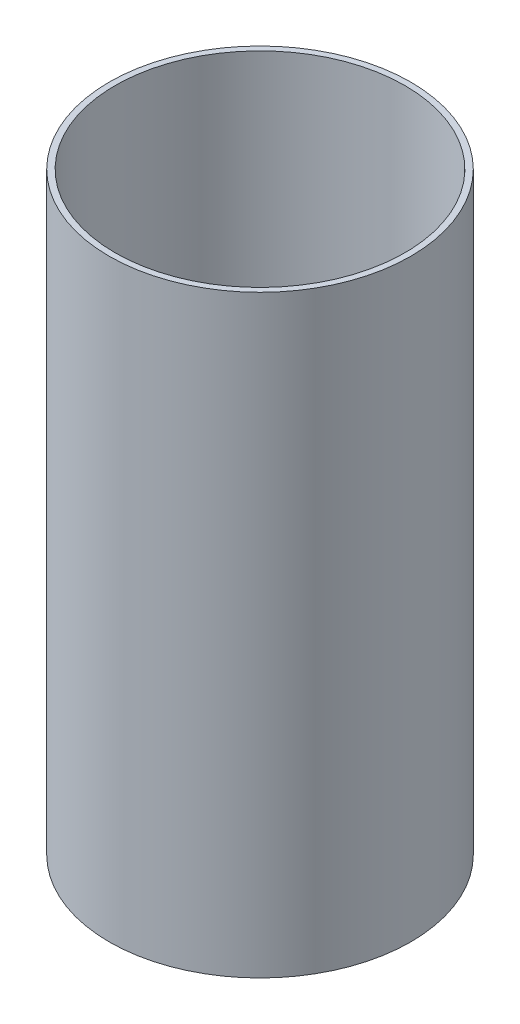
ISO-10303-21;
HEADER;
FILE_DESCRIPTION(('STEP AP214'),'2;1');
FILE_NAME('part.step','',(''),(''),'','','');
FILE_SCHEMA(('AUTOMOTIVE_DESIGN { 1 0 10303 214 1 1 1 1 }'));
ENDSEC;
DATA;
#1=APPLICATION_CONTEXT('core data for automotive mechanical design processes');
#2=APPLICATION_PROTOCOL_DEFINITION('international standard','automotive_design',2000,#1);
#3=PRODUCT_CONTEXT('',#1,'mechanical');
#4=PRODUCT('Part','Part','',(#3));
#5=PRODUCT_RELATED_PRODUCT_CATEGORY('part','',(#4));
#6=PRODUCT_DEFINITION_FORMATION('','',#4);
#7=PRODUCT_DEFINITION_CONTEXT('part definition',#1,'design');
#8=PRODUCT_DEFINITION('design','',#6,#7);
#9=PRODUCT_DEFINITION_SHAPE('','',#8);
#10=(LENGTH_UNIT() NAMED_UNIT(*) SI_UNIT(.MILLI.,.METRE.));
#11=(NAMED_UNIT(*) PLANE_ANGLE_UNIT() SI_UNIT($,.RADIAN.));
#12=(NAMED_UNIT(*) SI_UNIT($,.STERADIAN.) SOLID_ANGLE_UNIT());
#13=UNCERTAINTY_MEASURE_WITH_UNIT(LENGTH_MEASURE(1.E-05),#10,'distance_accuracy_value','');
#14=(GEOMETRIC_REPRESENTATION_CONTEXT(3) GLOBAL_UNCERTAINTY_ASSIGNED_CONTEXT((#13)) GLOBAL_UNIT_ASSIGNED_CONTEXT((#10,
#11,#12)) REPRESENTATION_CONTEXT('',''));
#15=CARTESIAN_POINT('',(0.,0.,0.));
#16=DIRECTION('',(0.,0.,1.));
#17=DIRECTION('',(1.,0.,0.));
#18=AXIS2_PLACEMENT_3D('',#15,#16,#17);
#19=CARTESIAN_POINT('',(0.,-150.,0.));
#20=DIRECTION('',(0.,1.,0.));
#21=DIRECTION('',(0.,0.,1.));
#22=AXIS2_PLACEMENT_3D('',#19,#20,#21);
#23=CYLINDRICAL_SURFACE('',#22,76.2);
#24=CARTESIAN_POINT('',(0.,-150.,0.));
#25=DIRECTION('',(0.,1.,0.));
#26=DIRECTION('',(0.,0.,1.));
#27=AXIS2_PLACEMENT_3D('',#24,#25,#26);
#28=CIRCLE('',#27,76.2);
#29=CARTESIAN_POINT('',(0.,-150.,76.2));
#30=VERTEX_POINT('',#29);
#31=EDGE_CURVE('E10',#30,#30,#28,.T.);
#32=ORIENTED_EDGE('',*,*,#31,.T.);
#33=EDGE_LOOP('',(#32));
#34=FACE_BOUND('',#33,.T.);
#35=CARTESIAN_POINT('',(0.,150.,0.));
#36=DIRECTION('',(0.,1.,0.));
#37=DIRECTION('',(0.,0.,1.));
#38=AXIS2_PLACEMENT_3D('',#35,#36,#37);
#39=CIRCLE('',#38,76.2);
#40=CARTESIAN_POINT('',(0.,150.,76.2));
#41=VERTEX_POINT('',#40);
#42=EDGE_CURVE('E49',#41,#41,#39,.T.);
#43=ORIENTED_EDGE('',*,*,#42,.F.);
#44=EDGE_LOOP('',(#43));
#45=FACE_BOUND('',#44,.T.);
#46=ADVANCED_FACE('F37',(#34,#45),#23,.T.);
#47=CARTESIAN_POINT('',(0.,-150.,0.));
#48=DIRECTION('',(0.,1.,0.));
#49=DIRECTION('',(0.,0.,1.));
#50=AXIS2_PLACEMENT_3D('',#47,#48,#49);
#51=PLANE('',#50);
#52=CARTESIAN_POINT('',(0.,-150.,0.));
#53=DIRECTION('',(0.,1.,0.));
#54=DIRECTION('',(0.,0.,1.));
#55=AXIS2_PLACEMENT_3D('',#52,#53,#54);
#56=CIRCLE('',#55,73.2);
#57=CARTESIAN_POINT('',(0.,-150.,73.2));
#58=VERTEX_POINT('',#57);
#59=EDGE_CURVE('E44',#58,#58,#56,.T.);
#60=ORIENTED_EDGE('',*,*,#59,.T.);
#61=EDGE_LOOP('',(#60));
#62=FACE_BOUND('',#61,.T.);
#63=ORIENTED_EDGE('',*,*,#31,.F.);
#64=EDGE_LOOP('',(#63));
#65=FACE_BOUND('',#64,.T.);
#66=ADVANCED_FACE('F70',(#62,#65),#51,.F.);
#67=CARTESIAN_POINT('',(0.,-150.,0.));
#68=DIRECTION('',(0.,1.,0.));
#69=DIRECTION('',(0.,0.,1.));
#70=AXIS2_PLACEMENT_3D('',#67,#68,#69);
#71=CYLINDRICAL_SURFACE('',#70,73.2);
#72=ORIENTED_EDGE('',*,*,#59,.F.);
#73=EDGE_LOOP('',(#72));
#74=FACE_BOUND('',#73,.T.);
#75=CARTESIAN_POINT('',(0.,150.,0.));
#76=DIRECTION('',(0.,1.,0.));
#77=DIRECTION('',(0.,0.,1.));
#78=AXIS2_PLACEMENT_3D('',#75,#76,#77);
#79=CIRCLE('',#78,73.2);
#80=CARTESIAN_POINT('',(0.,150.,73.2));
#81=VERTEX_POINT('',#80);
#82=EDGE_CURVE('E54',#81,#81,#79,.T.);
#83=ORIENTED_EDGE('',*,*,#82,.T.);
#84=EDGE_LOOP('',(#83));
#85=FACE_BOUND('',#84,.T.);
#86=ADVANCED_FACE('F61',(#74,#85),#71,.F.);
#87=CARTESIAN_POINT('',(0.,150.,0.));
#88=DIRECTION('',(0.,1.,0.));
#89=DIRECTION('',(0.,0.,1.));
#90=AXIS2_PLACEMENT_3D('',#87,#88,#89);
#91=PLANE('',#90);
#92=ORIENTED_EDGE('',*,*,#42,.T.);
#93=EDGE_LOOP('',(#92));
#94=FACE_BOUND('',#93,.T.);
#95=ORIENTED_EDGE('',*,*,#82,.F.);
#96=EDGE_LOOP('',(#95));
#97=FACE_BOUND('',#96,.T.);
#98=ADVANCED_FACE('F63',(#94,#97),#91,.T.);
#99=CLOSED_SHELL('',(#46,#66,#86,#98));
#100=MANIFOLD_SOLID_BREP('B2',#99);
#101=ADVANCED_BREP_SHAPE_REPRESENTATION('',(#18,#100),#14);
#102=SHAPE_DEFINITION_REPRESENTATION(#9,#101);
ENDSEC;
END-ISO-10303-21;
